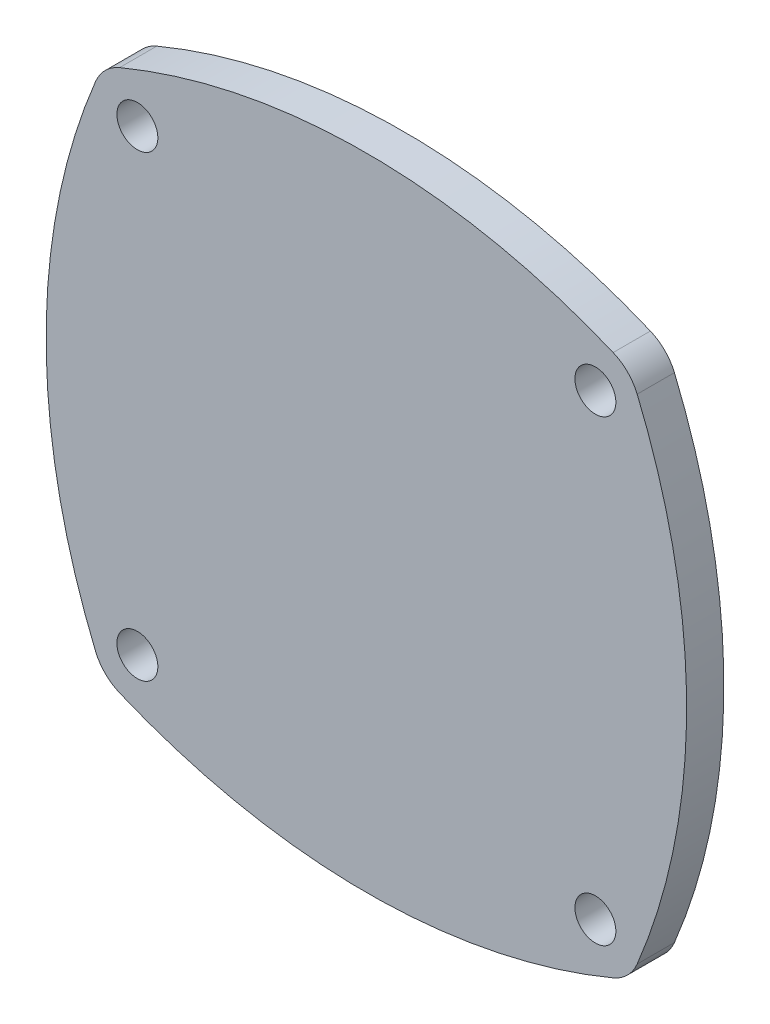
ISO-10303-21;
HEADER;
FILE_DESCRIPTION(('STEP AP214'),'2;1');
FILE_NAME('part.step','',(''),(''),'','','');
FILE_SCHEMA(('AUTOMOTIVE_DESIGN { 1 0 10303 214 1 1 1 1 }'));
ENDSEC;
DATA;
#1=APPLICATION_CONTEXT('core data for automotive mechanical design processes');
#2=APPLICATION_PROTOCOL_DEFINITION('international standard','automotive_design',2000,#1);
#3=PRODUCT_CONTEXT('',#1,'mechanical');
#4=PRODUCT('Part','Part','',(#3));
#5=PRODUCT_RELATED_PRODUCT_CATEGORY('part','',(#4));
#6=PRODUCT_DEFINITION_FORMATION('','',#4);
#7=PRODUCT_DEFINITION_CONTEXT('part definition',#1,'design');
#8=PRODUCT_DEFINITION('design','',#6,#7);
#9=PRODUCT_DEFINITION_SHAPE('','',#8);
#10=(LENGTH_UNIT() NAMED_UNIT(*) SI_UNIT(.MILLI.,.METRE.));
#11=(NAMED_UNIT(*) PLANE_ANGLE_UNIT() SI_UNIT($,.RADIAN.));
#12=(NAMED_UNIT(*) SI_UNIT($,.STERADIAN.) SOLID_ANGLE_UNIT());
#13=UNCERTAINTY_MEASURE_WITH_UNIT(LENGTH_MEASURE(1.E-05),#10,'distance_accuracy_value','');
#14=(GEOMETRIC_REPRESENTATION_CONTEXT(3) GLOBAL_UNCERTAINTY_ASSIGNED_CONTEXT((#13)) GLOBAL_UNIT_ASSIGNED_CONTEXT((#10,
#11,#12)) REPRESENTATION_CONTEXT('',''));
#15=CARTESIAN_POINT('',(0.,0.,0.));
#16=DIRECTION('',(0.,0.,1.));
#17=DIRECTION('',(1.,0.,0.));
#18=AXIS2_PLACEMENT_3D('',#15,#16,#17);
#19=CARTESIAN_POINT('',(0.,0.,-5.));
#20=DIRECTION('',(0.,0.,1.));
#21=DIRECTION('',(1.,0.,0.));
#22=AXIS2_PLACEMENT_3D('',#19,#20,#21);
#23=PLANE('',#22);
#24=CARTESIAN_POINT('',(-30.75,-30.75,-5.));
#25=DIRECTION('',(0.,0.,-1.));
#26=DIRECTION('',(-1.,0.,0.));
#27=AXIS2_PLACEMENT_3D('',#24,#25,#26);
#28=CIRCLE('',#27,2.75000000000001);
#29=CARTESIAN_POINT('',(-33.5,-30.75,-5.));
#30=VERTEX_POINT('',#29);
#31=EDGE_CURVE('E127',#30,#30,#28,.F.);
#32=ORIENTED_EDGE('',*,*,#31,.T.);
#33=EDGE_LOOP('',(#32));
#34=FACE_BOUND('',#33,.T.);
#35=CARTESIAN_POINT('',(30.75,30.75,-5.));
#36=DIRECTION('',(0.,0.,-1.));
#37=DIRECTION('',(-1.,0.,0.));
#38=AXIS2_PLACEMENT_3D('',#35,#36,#37);
#39=CIRCLE('',#38,2.74999999999999);
#40=CARTESIAN_POINT('',(28.,30.75,-5.));
#41=VERTEX_POINT('',#40);
#42=EDGE_CURVE('E130',#41,#41,#39,.F.);
#43=ORIENTED_EDGE('',*,*,#42,.T.);
#44=EDGE_LOOP('',(#43));
#45=FACE_BOUND('',#44,.T.);
#46=CARTESIAN_POINT('',(-30.75,30.75,-5.));
#47=DIRECTION('',(0.,0.,-1.));
#48=DIRECTION('',(-1.,0.,0.));
#49=AXIS2_PLACEMENT_3D('',#46,#47,#48);
#50=CIRCLE('',#49,2.75);
#51=CARTESIAN_POINT('',(-33.5,30.75,-5.));
#52=VERTEX_POINT('',#51);
#53=EDGE_CURVE('E133',#52,#52,#50,.F.);
#54=ORIENTED_EDGE('',*,*,#53,.T.);
#55=EDGE_LOOP('',(#54));
#56=FACE_BOUND('',#55,.T.);
#57=CARTESIAN_POINT('',(30.75,-30.75,-5.));
#58=DIRECTION('',(0.,0.,-1.));
#59=DIRECTION('',(-1.,0.,0.));
#60=AXIS2_PLACEMENT_3D('',#57,#58,#59);
#61=CIRCLE('',#60,2.75);
#62=CARTESIAN_POINT('',(28.,-30.75,-5.));
#63=VERTEX_POINT('',#62);
#64=EDGE_CURVE('E90',#63,#63,#61,.F.);
#65=ORIENTED_EDGE('',*,*,#64,.T.);
#66=EDGE_LOOP('',(#65));
#67=FACE_BOUND('',#66,.T.);
#68=CARTESIAN_POINT('',(0.,43.,-5.));
#69=DIRECTION('',(0.,0.,-1.));
#70=DIRECTION('',(-1.,0.,0.));
#71=AXIS2_PLACEMENT_3D('',#68,#69,#70);
#72=CIRCLE('',#71,86.);
#73=CARTESIAN_POINT('',(-33.1352763449365,-36.3602763449366,-5.));
#74=VERTEX_POINT('',#73);
#75=CARTESIAN_POINT('',(33.1352763449365,-36.3602763449366,-5.));
#76=VERTEX_POINT('',#75);
#77=EDGE_CURVE('E138',#74,#76,#72,.F.);
#78=ORIENTED_EDGE('',*,*,#77,.F.);
#79=CARTESIAN_POINT('',(-30.8235128790107,-30.8235128790108,-5.));
#80=DIRECTION('',(0.,0.,-1.));
#81=DIRECTION('',(-1.,0.,0.));
#82=AXIS2_PLACEMENT_3D('',#79,#80,#81);
#83=CIRCLE('',#82,6.);
#84=CARTESIAN_POINT('',(-36.3602763449365,-33.1352763449366,-5.));
#85=VERTEX_POINT('',#84);
#86=EDGE_CURVE('E141',#85,#74,#83,.F.);
#87=ORIENTED_EDGE('',*,*,#86,.F.);
#88=CARTESIAN_POINT('',(43.,0.,-5.));
#89=DIRECTION('',(0.,0.,-1.));
#90=DIRECTION('',(-1.,0.,0.));
#91=AXIS2_PLACEMENT_3D('',#88,#89,#90);
#92=CIRCLE('',#91,86.);
#93=CARTESIAN_POINT('',(-36.3602763449366,33.1352763449365,-5.));
#94=VERTEX_POINT('',#93);
#95=EDGE_CURVE('E144',#94,#85,#92,.F.);
#96=ORIENTED_EDGE('',*,*,#95,.F.);
#97=CARTESIAN_POINT('',(-30.8235128790108,30.8235128790107,-5.));
#98=DIRECTION('',(0.,0.,-1.));
#99=DIRECTION('',(-1.,0.,0.));
#100=AXIS2_PLACEMENT_3D('',#97,#98,#99);
#101=CIRCLE('',#100,6.);
#102=CARTESIAN_POINT('',(-33.1352763449366,36.3602763449365,-5.));
#103=VERTEX_POINT('',#102);
#104=EDGE_CURVE('E148',#103,#94,#101,.F.);
#105=ORIENTED_EDGE('',*,*,#104,.F.);
#106=CARTESIAN_POINT('',(0.,-43.,-5.));
#107=DIRECTION('',(0.,0.,-1.));
#108=DIRECTION('',(-1.,0.,0.));
#109=AXIS2_PLACEMENT_3D('',#106,#107,#108);
#110=CIRCLE('',#109,86.);
#111=CARTESIAN_POINT('',(33.1352763449365,36.3602763449365,-5.));
#112=VERTEX_POINT('',#111);
#113=EDGE_CURVE('E151',#112,#103,#110,.F.);
#114=ORIENTED_EDGE('',*,*,#113,.F.);
#115=CARTESIAN_POINT('',(30.8235128790107,30.8235128790107,-5.));
#116=DIRECTION('',(0.,0.,-1.));
#117=DIRECTION('',(-1.,0.,0.));
#118=AXIS2_PLACEMENT_3D('',#115,#116,#117);
#119=CIRCLE('',#118,6.);
#120=CARTESIAN_POINT('',(36.3602763449365,33.1352763449365,-5.));
#121=VERTEX_POINT('',#120);
#122=EDGE_CURVE('E79',#121,#112,#119,.F.);
#123=ORIENTED_EDGE('',*,*,#122,.F.);
#124=CARTESIAN_POINT('',(-43.,0.,-5.));
#125=DIRECTION('',(0.,0.,-1.));
#126=DIRECTION('',(-1.,0.,0.));
#127=AXIS2_PLACEMENT_3D('',#124,#125,#126);
#128=CIRCLE('',#127,86.);
#129=CARTESIAN_POINT('',(36.3602763449365,-33.1352763449365,-5.));
#130=VERTEX_POINT('',#129);
#131=EDGE_CURVE('E20',#130,#121,#128,.F.);
#132=ORIENTED_EDGE('',*,*,#131,.F.);
#133=CARTESIAN_POINT('',(30.8235128790107,-30.8235128790107,-5.));
#134=DIRECTION('',(0.,0.,-1.));
#135=DIRECTION('',(-1.,0.,0.));
#136=AXIS2_PLACEMENT_3D('',#133,#134,#135);
#137=CIRCLE('',#136,6.);
#138=EDGE_CURVE('E83',#76,#130,#137,.F.);
#139=ORIENTED_EDGE('',*,*,#138,.F.);
#140=EDGE_LOOP('',(#78,#87,#96,#105,#114,#123,#132,#139));
#141=FACE_BOUND('',#140,.T.);
#142=ADVANCED_FACE('F16',(#34,#45,#56,#67,#141),#23,.F.);
#143=CARTESIAN_POINT('',(-43.,0.,0.));
#144=DIRECTION('',(0.,0.,-1.));
#145=DIRECTION('',(-1.,0.,0.));
#146=AXIS2_PLACEMENT_3D('',#143,#144,#145);
#147=CYLINDRICAL_SURFACE('',#146,86.);
#148=DIRECTION('',(0.,0.,-1.));
#149=VECTOR('',#148,1.);
#150=CARTESIAN_POINT('',(36.3602763449365,33.1352763449365,0.));
#151=LINE('',#150,#149);
#152=CARTESIAN_POINT('',(36.3602763449365,33.1352763449365,0.));
#153=VERTEX_POINT('',#152);
#154=EDGE_CURVE('E94',#153,#121,#151,.T.);
#155=ORIENTED_EDGE('',*,*,#154,.F.);
#156=CARTESIAN_POINT('',(-43.,0.,0.));
#157=DIRECTION('',(0.,0.,-1.));
#158=DIRECTION('',(-1.,0.,0.));
#159=AXIS2_PLACEMENT_3D('',#156,#157,#158);
#160=CIRCLE('',#159,86.);
#161=CARTESIAN_POINT('',(36.3602763449365,-33.1352763449365,0.));
#162=VERTEX_POINT('',#161);
#163=EDGE_CURVE('E97',#162,#153,#160,.F.);
#164=ORIENTED_EDGE('',*,*,#163,.F.);
#165=DIRECTION('',(0.,0.,-1.));
#166=VECTOR('',#165,1.);
#167=CARTESIAN_POINT('',(36.3602763449365,-33.1352763449365,0.));
#168=LINE('',#167,#166);
#169=EDGE_CURVE('E86',#162,#130,#168,.T.);
#170=ORIENTED_EDGE('',*,*,#169,.T.);
#171=ORIENTED_EDGE('',*,*,#131,.T.);
#172=EDGE_LOOP('',(#155,#164,#170,#171));
#173=FACE_BOUND('',#172,.T.);
#174=ADVANCED_FACE('F95',(#173),#147,.T.);
#175=CARTESIAN_POINT('',(30.8235128790107,30.8235128790107,0.));
#176=DIRECTION('',(0.,0.,-1.));
#177=DIRECTION('',(-1.,0.,0.));
#178=AXIS2_PLACEMENT_3D('',#175,#176,#177);
#179=CYLINDRICAL_SURFACE('',#178,6.);
#180=DIRECTION('',(0.,0.,-1.));
#181=VECTOR('',#180,1.);
#182=CARTESIAN_POINT('',(33.1352763449365,36.3602763449365,0.));
#183=LINE('',#182,#181);
#184=CARTESIAN_POINT('',(33.1352763449365,36.3602763449365,0.));
#185=VERTEX_POINT('',#184);
#186=EDGE_CURVE('E153',#185,#112,#183,.T.);
#187=ORIENTED_EDGE('',*,*,#186,.F.);
#188=CARTESIAN_POINT('',(30.8235128790107,30.8235128790107,0.));
#189=DIRECTION('',(0.,0.,-1.));
#190=DIRECTION('',(-1.,0.,0.));
#191=AXIS2_PLACEMENT_3D('',#188,#189,#190);
#192=CIRCLE('',#191,6.);
#193=EDGE_CURVE('E123',#153,#185,#192,.F.);
#194=ORIENTED_EDGE('',*,*,#193,.F.);
#195=ORIENTED_EDGE('',*,*,#154,.T.);
#196=ORIENTED_EDGE('',*,*,#122,.T.);
#197=EDGE_LOOP('',(#187,#194,#195,#196));
#198=FACE_BOUND('',#197,.T.);
#199=ADVANCED_FACE('F158',(#198),#179,.T.);
#200=CARTESIAN_POINT('',(0.,-43.,0.));
#201=DIRECTION('',(0.,0.,-1.));
#202=DIRECTION('',(-1.,0.,0.));
#203=AXIS2_PLACEMENT_3D('',#200,#201,#202);
#204=CYLINDRICAL_SURFACE('',#203,86.);
#205=DIRECTION('',(0.,0.,-1.));
#206=VECTOR('',#205,1.);
#207=CARTESIAN_POINT('',(-33.1352763449366,36.3602763449365,0.));
#208=LINE('',#207,#206);
#209=CARTESIAN_POINT('',(-33.1352763449366,36.3602763449365,0.));
#210=VERTEX_POINT('',#209);
#211=EDGE_CURVE('E150',#210,#103,#208,.T.);
#212=ORIENTED_EDGE('',*,*,#211,.F.);
#213=CARTESIAN_POINT('',(0.,-43.,0.));
#214=DIRECTION('',(0.,0.,-1.));
#215=DIRECTION('',(-1.,0.,0.));
#216=AXIS2_PLACEMENT_3D('',#213,#214,#215);
#217=CIRCLE('',#216,86.);
#218=EDGE_CURVE('E120',#185,#210,#217,.F.);
#219=ORIENTED_EDGE('',*,*,#218,.F.);
#220=ORIENTED_EDGE('',*,*,#186,.T.);
#221=ORIENTED_EDGE('',*,*,#113,.T.);
#222=EDGE_LOOP('',(#212,#219,#220,#221));
#223=FACE_BOUND('',#222,.T.);
#224=ADVANCED_FACE('F182',(#223),#204,.T.);
#225=CARTESIAN_POINT('',(-30.8235128790108,30.8235128790107,0.));
#226=DIRECTION('',(0.,0.,-1.));
#227=DIRECTION('',(-1.,0.,0.));
#228=AXIS2_PLACEMENT_3D('',#225,#226,#227);
#229=CYLINDRICAL_SURFACE('',#228,6.);
#230=DIRECTION('',(0.,0.,-1.));
#231=VECTOR('',#230,1.);
#232=CARTESIAN_POINT('',(-36.3602763449366,33.1352763449365,0.));
#233=LINE('',#232,#231);
#234=CARTESIAN_POINT('',(-36.3602763449366,33.1352763449365,0.));
#235=VERTEX_POINT('',#234);
#236=EDGE_CURVE('E147',#235,#94,#233,.T.);
#237=ORIENTED_EDGE('',*,*,#236,.F.);
#238=CARTESIAN_POINT('',(-30.8235128790108,30.8235128790107,0.));
#239=DIRECTION('',(0.,0.,-1.));
#240=DIRECTION('',(-1.,0.,0.));
#241=AXIS2_PLACEMENT_3D('',#238,#239,#240);
#242=CIRCLE('',#241,6.);
#243=EDGE_CURVE('E118',#210,#235,#242,.F.);
#244=ORIENTED_EDGE('',*,*,#243,.F.);
#245=ORIENTED_EDGE('',*,*,#211,.T.);
#246=ORIENTED_EDGE('',*,*,#104,.T.);
#247=EDGE_LOOP('',(#237,#244,#245,#246));
#248=FACE_BOUND('',#247,.T.);
#249=ADVANCED_FACE('F179',(#248),#229,.T.);
#250=CARTESIAN_POINT('',(43.,0.,0.));
#251=DIRECTION('',(0.,0.,-1.));
#252=DIRECTION('',(-1.,0.,0.));
#253=AXIS2_PLACEMENT_3D('',#250,#251,#252);
#254=CYLINDRICAL_SURFACE('',#253,86.);
#255=ORIENTED_EDGE('',*,*,#236,.T.);
#256=ORIENTED_EDGE('',*,*,#95,.T.);
#257=DIRECTION('',(0.,0.,-1.));
#258=VECTOR('',#257,1.);
#259=CARTESIAN_POINT('',(-36.3602763449365,-33.1352763449366,0.));
#260=LINE('',#259,#258);
#261=CARTESIAN_POINT('',(-36.3602763449365,-33.1352763449366,0.));
#262=VERTEX_POINT('',#261);
#263=EDGE_CURVE('E143',#262,#85,#260,.T.);
#264=ORIENTED_EDGE('',*,*,#263,.F.);
#265=CARTESIAN_POINT('',(43.,0.,0.));
#266=DIRECTION('',(0.,0.,-1.));
#267=DIRECTION('',(-1.,0.,0.));
#268=AXIS2_PLACEMENT_3D('',#265,#266,#267);
#269=CIRCLE('',#268,86.);
#270=EDGE_CURVE('E115',#235,#262,#269,.F.);
#271=ORIENTED_EDGE('',*,*,#270,.F.);
#272=EDGE_LOOP('',(#255,#256,#264,#271));
#273=FACE_BOUND('',#272,.T.);
#274=ADVANCED_FACE('F185',(#273),#254,.T.);
#275=CARTESIAN_POINT('',(-30.8235128790107,-30.8235128790108,0.));
#276=DIRECTION('',(0.,0.,-1.));
#277=DIRECTION('',(-1.,0.,0.));
#278=AXIS2_PLACEMENT_3D('',#275,#276,#277);
#279=CYLINDRICAL_SURFACE('',#278,6.);
#280=DIRECTION('',(0.,0.,-1.));
#281=VECTOR('',#280,1.);
#282=CARTESIAN_POINT('',(-33.1352763449365,-36.3602763449366,0.));
#283=LINE('',#282,#281);
#284=CARTESIAN_POINT('',(-33.1352763449365,-36.3602763449366,0.));
#285=VERTEX_POINT('',#284);
#286=EDGE_CURVE('E140',#285,#74,#283,.T.);
#287=ORIENTED_EDGE('',*,*,#286,.F.);
#288=CARTESIAN_POINT('',(-30.8235128790107,-30.8235128790108,0.));
#289=DIRECTION('',(0.,0.,-1.));
#290=DIRECTION('',(-1.,0.,0.));
#291=AXIS2_PLACEMENT_3D('',#288,#289,#290);
#292=CIRCLE('',#291,6.);
#293=EDGE_CURVE('E113',#262,#285,#292,.F.);
#294=ORIENTED_EDGE('',*,*,#293,.F.);
#295=ORIENTED_EDGE('',*,*,#263,.T.);
#296=ORIENTED_EDGE('',*,*,#86,.T.);
#297=EDGE_LOOP('',(#287,#294,#295,#296));
#298=FACE_BOUND('',#297,.T.);
#299=ADVANCED_FACE('F187',(#298),#279,.T.);
#300=CARTESIAN_POINT('',(0.,43.,0.));
#301=DIRECTION('',(0.,0.,-1.));
#302=DIRECTION('',(-1.,0.,0.));
#303=AXIS2_PLACEMENT_3D('',#300,#301,#302);
#304=CYLINDRICAL_SURFACE('',#303,86.);
#305=ORIENTED_EDGE('',*,*,#286,.T.);
#306=ORIENTED_EDGE('',*,*,#77,.T.);
#307=DIRECTION('',(0.,0.,-1.));
#308=VECTOR('',#307,1.);
#309=CARTESIAN_POINT('',(33.1352763449365,-36.3602763449366,0.));
#310=LINE('',#309,#308);
#311=CARTESIAN_POINT('',(33.1352763449365,-36.3602763449366,0.));
#312=VERTEX_POINT('',#311);
#313=EDGE_CURVE('E88',#312,#76,#310,.T.);
#314=ORIENTED_EDGE('',*,*,#313,.F.);
#315=CARTESIAN_POINT('',(0.,43.,0.));
#316=DIRECTION('',(0.,0.,-1.));
#317=DIRECTION('',(-1.,0.,0.));
#318=AXIS2_PLACEMENT_3D('',#315,#316,#317);
#319=CIRCLE('',#318,86.);
#320=EDGE_CURVE('E110',#285,#312,#319,.F.);
#321=ORIENTED_EDGE('',*,*,#320,.F.);
#322=EDGE_LOOP('',(#305,#306,#314,#321));
#323=FACE_BOUND('',#322,.T.);
#324=ADVANCED_FACE('F167',(#323),#304,.T.);
#325=CARTESIAN_POINT('',(30.8235128790107,-30.8235128790107,0.));
#326=DIRECTION('',(0.,0.,-1.));
#327=DIRECTION('',(-1.,0.,0.));
#328=AXIS2_PLACEMENT_3D('',#325,#326,#327);
#329=CYLINDRICAL_SURFACE('',#328,6.);
#330=ORIENTED_EDGE('',*,*,#313,.T.);
#331=ORIENTED_EDGE('',*,*,#138,.T.);
#332=ORIENTED_EDGE('',*,*,#169,.F.);
#333=CARTESIAN_POINT('',(30.8235128790107,-30.8235128790107,0.));
#334=DIRECTION('',(0.,0.,-1.));
#335=DIRECTION('',(-1.,0.,0.));
#336=AXIS2_PLACEMENT_3D('',#333,#334,#335);
#337=CIRCLE('',#336,6.);
#338=EDGE_CURVE('E35',#312,#162,#337,.F.);
#339=ORIENTED_EDGE('',*,*,#338,.F.);
#340=EDGE_LOOP('',(#330,#331,#332,#339));
#341=FACE_BOUND('',#340,.T.);
#342=ADVANCED_FACE('F84',(#341),#329,.T.);
#343=CARTESIAN_POINT('',(30.75,-30.75,0.));
#344=DIRECTION('',(0.,0.,-1.));
#345=DIRECTION('',(-1.,0.,0.));
#346=AXIS2_PLACEMENT_3D('',#343,#344,#345);
#347=CYLINDRICAL_SURFACE('',#346,2.75);
#348=CARTESIAN_POINT('',(30.75,-30.75,0.));
#349=DIRECTION('',(0.,0.,-1.));
#350=DIRECTION('',(-1.,0.,0.));
#351=AXIS2_PLACEMENT_3D('',#348,#349,#350);
#352=CIRCLE('',#351,2.75);
#353=CARTESIAN_POINT('',(28.,-30.75,0.));
#354=VERTEX_POINT('',#353);
#355=EDGE_CURVE('E107',#354,#354,#352,.T.);
#356=ORIENTED_EDGE('',*,*,#355,.F.);
#357=EDGE_LOOP('',(#356));
#358=FACE_BOUND('',#357,.T.);
#359=ORIENTED_EDGE('',*,*,#64,.F.);
#360=EDGE_LOOP('',(#359));
#361=FACE_BOUND('',#360,.T.);
#362=ADVANCED_FACE('F208',(#358,#361),#347,.F.);
#363=CARTESIAN_POINT('',(-30.75,30.75,0.));
#364=DIRECTION('',(0.,0.,-1.));
#365=DIRECTION('',(-1.,0.,0.));
#366=AXIS2_PLACEMENT_3D('',#363,#364,#365);
#367=CYLINDRICAL_SURFACE('',#366,2.75);
#368=CARTESIAN_POINT('',(-30.75,30.75,0.));
#369=DIRECTION('',(0.,0.,-1.));
#370=DIRECTION('',(-1.,0.,0.));
#371=AXIS2_PLACEMENT_3D('',#368,#369,#370);
#372=CIRCLE('',#371,2.75);
#373=CARTESIAN_POINT('',(-33.5,30.75,0.));
#374=VERTEX_POINT('',#373);
#375=EDGE_CURVE('E104',#374,#374,#372,.T.);
#376=ORIENTED_EDGE('',*,*,#375,.F.);
#377=EDGE_LOOP('',(#376));
#378=FACE_BOUND('',#377,.T.);
#379=ORIENTED_EDGE('',*,*,#53,.F.);
#380=EDGE_LOOP('',(#379));
#381=FACE_BOUND('',#380,.T.);
#382=ADVANCED_FACE('F212',(#378,#381),#367,.F.);
#383=CARTESIAN_POINT('',(30.75,30.75,0.));
#384=DIRECTION('',(0.,0.,-1.));
#385=DIRECTION('',(-1.,0.,0.));
#386=AXIS2_PLACEMENT_3D('',#383,#384,#385);
#387=CYLINDRICAL_SURFACE('',#386,2.74999999999999);
#388=CARTESIAN_POINT('',(30.75,30.75,0.));
#389=DIRECTION('',(0.,0.,-1.));
#390=DIRECTION('',(-1.,0.,0.));
#391=AXIS2_PLACEMENT_3D('',#388,#389,#390);
#392=CIRCLE('',#391,2.74999999999999);
#393=CARTESIAN_POINT('',(28.,30.75,0.));
#394=VERTEX_POINT('',#393);
#395=EDGE_CURVE('E26',#394,#394,#392,.T.);
#396=ORIENTED_EDGE('',*,*,#395,.F.);
#397=EDGE_LOOP('',(#396));
#398=FACE_BOUND('',#397,.T.);
#399=ORIENTED_EDGE('',*,*,#42,.F.);
#400=EDGE_LOOP('',(#399));
#401=FACE_BOUND('',#400,.T.);
#402=ADVANCED_FACE('F203',(#398,#401),#387,.F.);
#403=CARTESIAN_POINT('',(-30.75,-30.75,0.));
#404=DIRECTION('',(0.,0.,-1.));
#405=DIRECTION('',(-1.,0.,0.));
#406=AXIS2_PLACEMENT_3D('',#403,#404,#405);
#407=CYLINDRICAL_SURFACE('',#406,2.75000000000001);
#408=CARTESIAN_POINT('',(-30.75,-30.75,0.));
#409=DIRECTION('',(0.,0.,-1.));
#410=DIRECTION('',(-1.,0.,0.));
#411=AXIS2_PLACEMENT_3D('',#408,#409,#410);
#412=CIRCLE('',#411,2.75000000000001);
#413=CARTESIAN_POINT('',(-33.5,-30.75,0.));
#414=VERTEX_POINT('',#413);
#415=EDGE_CURVE('E11',#414,#414,#412,.T.);
#416=ORIENTED_EDGE('',*,*,#415,.F.);
#417=EDGE_LOOP('',(#416));
#418=FACE_BOUND('',#417,.T.);
#419=ORIENTED_EDGE('',*,*,#31,.F.);
#420=EDGE_LOOP('',(#419));
#421=FACE_BOUND('',#420,.T.);
#422=ADVANCED_FACE('F18',(#418,#421),#407,.F.);
#423=CARTESIAN_POINT('',(0.,0.,0.));
#424=DIRECTION('',(0.,0.,1.));
#425=DIRECTION('',(1.,0.,0.));
#426=AXIS2_PLACEMENT_3D('',#423,#424,#425);
#427=PLANE('',#426);
#428=ORIENTED_EDGE('',*,*,#415,.T.);
#429=EDGE_LOOP('',(#428));
#430=FACE_BOUND('',#429,.T.);
#431=ORIENTED_EDGE('',*,*,#395,.T.);
#432=EDGE_LOOP('',(#431));
#433=FACE_BOUND('',#432,.T.);
#434=ORIENTED_EDGE('',*,*,#375,.T.);
#435=EDGE_LOOP('',(#434));
#436=FACE_BOUND('',#435,.T.);
#437=ORIENTED_EDGE('',*,*,#355,.T.);
#438=EDGE_LOOP('',(#437));
#439=FACE_BOUND('',#438,.T.);
#440=ORIENTED_EDGE('',*,*,#320,.T.);
#441=ORIENTED_EDGE('',*,*,#338,.T.);
#442=ORIENTED_EDGE('',*,*,#163,.T.);
#443=ORIENTED_EDGE('',*,*,#193,.T.);
#444=ORIENTED_EDGE('',*,*,#218,.T.);
#445=ORIENTED_EDGE('',*,*,#243,.T.);
#446=ORIENTED_EDGE('',*,*,#270,.T.);
#447=ORIENTED_EDGE('',*,*,#293,.T.);
#448=EDGE_LOOP('',(#440,#441,#442,#443,#444,#445,#446,#447));
#449=FACE_BOUND('',#448,.T.);
#450=ADVANCED_FACE('F161',(#430,#433,#436,#439,#449),#427,.T.);
#451=CLOSED_SHELL('',(#142,#174,#199,#224,#249,#274,#299,#324,#342,#362,#382,#402,#422,#450));
#452=MANIFOLD_SOLID_BREP('B1',#451);
#453=ADVANCED_BREP_SHAPE_REPRESENTATION('',(#18,#452),#14);
#454=SHAPE_DEFINITION_REPRESENTATION(#9,#453);
ENDSEC;
END-ISO-10303-21;
